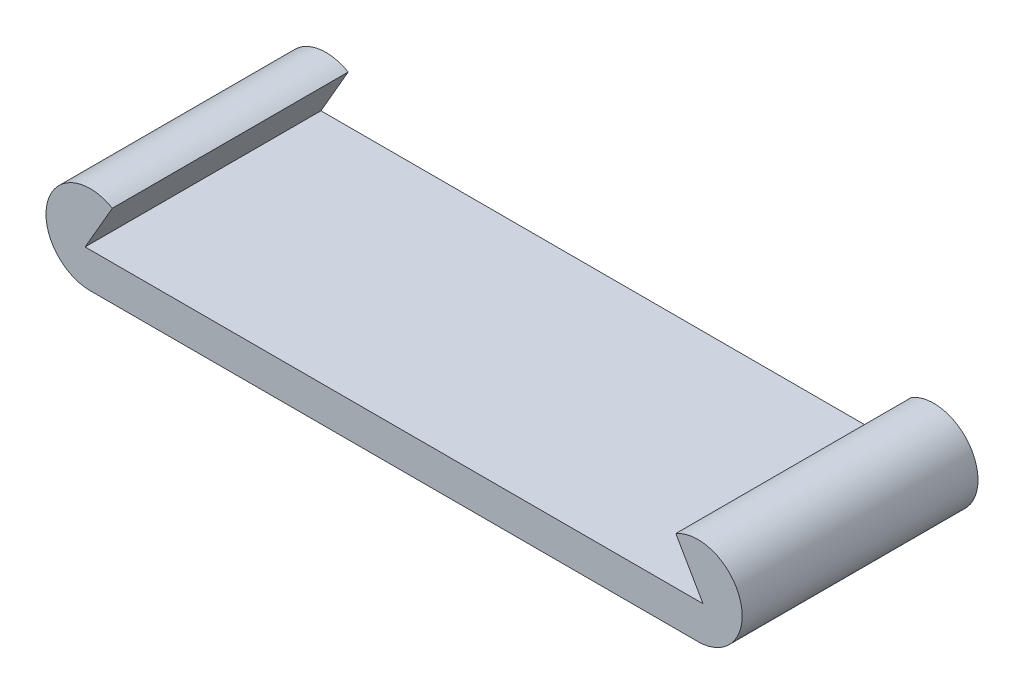
ISO-10303-21;
HEADER;
FILE_DESCRIPTION(('STEP AP214'),'2;1');
FILE_NAME('part.step','',(''),(''),'','','');
FILE_SCHEMA(('AUTOMOTIVE_DESIGN { 1 0 10303 214 1 1 1 1 }'));
ENDSEC;
DATA;
#1=APPLICATION_CONTEXT('core data for automotive mechanical design processes');
#2=APPLICATION_PROTOCOL_DEFINITION('international standard','automotive_design',2000,#1);
#3=PRODUCT_CONTEXT('',#1,'mechanical');
#4=PRODUCT('Part','Part','',(#3));
#5=PRODUCT_RELATED_PRODUCT_CATEGORY('part','',(#4));
#6=PRODUCT_DEFINITION_FORMATION('','',#4);
#7=PRODUCT_DEFINITION_CONTEXT('part definition',#1,'design');
#8=PRODUCT_DEFINITION('design','',#6,#7);
#9=PRODUCT_DEFINITION_SHAPE('','',#8);
#10=(LENGTH_UNIT() NAMED_UNIT(*) SI_UNIT(.MILLI.,.METRE.));
#11=(NAMED_UNIT(*) PLANE_ANGLE_UNIT() SI_UNIT($,.RADIAN.));
#12=(NAMED_UNIT(*) SI_UNIT($,.STERADIAN.) SOLID_ANGLE_UNIT());
#13=UNCERTAINTY_MEASURE_WITH_UNIT(LENGTH_MEASURE(1.E-05),#10,'distance_accuracy_value','');
#14=(GEOMETRIC_REPRESENTATION_CONTEXT(3) GLOBAL_UNCERTAINTY_ASSIGNED_CONTEXT((#13)) GLOBAL_UNIT_ASSIGNED_CONTEXT((#10,
#11,#12)) REPRESENTATION_CONTEXT('',''));
#15=CARTESIAN_POINT('',(0.,0.,0.));
#16=DIRECTION('',(0.,0.,1.));
#17=DIRECTION('',(1.,0.,0.));
#18=AXIS2_PLACEMENT_3D('',#15,#16,#17);
#19=CARTESIAN_POINT('',(13.1,1.5,10.));
#20=DIRECTION('',(0.,-1.,0.));
#21=DIRECTION('',(0.,0.,-1.));
#22=AXIS2_PLACEMENT_3D('',#19,#20,#21);
#23=PLANE('',#22);
#24=DIRECTION('',(-1.,0.,0.));
#25=VECTOR('',#24,1.);
#26=CARTESIAN_POINT('',(13.1,1.5,0.));
#27=LINE('',#26,#25);
#28=CARTESIAN_POINT('',(13.1,1.5,0.));
#29=VERTEX_POINT('',#28);
#30=CARTESIAN_POINT('',(-13.1,1.5,0.));
#31=VERTEX_POINT('',#30);
#32=EDGE_CURVE('E115',#29,#31,#27,.T.);
#33=ORIENTED_EDGE('',*,*,#32,.T.);
#34=DIRECTION('',(0.,0.,-1.));
#35=VECTOR('',#34,1.);
#36=CARTESIAN_POINT('',(-13.1,1.5,10.));
#37=LINE('',#36,#35);
#38=CARTESIAN_POINT('',(-13.1,1.5,10.));
#39=VERTEX_POINT('',#38);
#40=EDGE_CURVE('E11',#39,#31,#37,.T.);
#41=ORIENTED_EDGE('',*,*,#40,.F.);
#42=DIRECTION('',(-1.,0.,0.));
#43=VECTOR('',#42,1.);
#44=CARTESIAN_POINT('',(13.1,1.5,10.));
#45=LINE('',#44,#43);
#46=CARTESIAN_POINT('',(13.1,1.5,10.));
#47=VERTEX_POINT('',#46);
#48=EDGE_CURVE('E125',#47,#39,#45,.T.);
#49=ORIENTED_EDGE('',*,*,#48,.F.);
#50=DIRECTION('',(0.,0.,-1.));
#51=VECTOR('',#50,1.);
#52=CARTESIAN_POINT('',(13.1,1.5,10.));
#53=LINE('',#52,#51);
#54=EDGE_CURVE('E111',#47,#29,#53,.T.);
#55=ORIENTED_EDGE('',*,*,#54,.T.);
#56=EDGE_LOOP('',(#33,#41,#49,#55));
#57=FACE_BOUND('',#56,.T.);
#58=ADVANCED_FACE('F31',(#57),#23,.F.);
#59=CARTESIAN_POINT('',(-13.1,1.5,10.));
#60=DIRECTION('',(-0.866025403784441,0.499999999999997,0.));
#61=DIRECTION('',(-0.499999999999997,-0.866025403784441,0.));
#62=AXIS2_PLACEMENT_3D('',#59,#60,#61);
#63=PLANE('',#62);
#64=DIRECTION('',(0.499999999999997,0.86602540378444,0.));
#65=VECTOR('',#64,1.);
#66=CARTESIAN_POINT('',(-13.1,1.5,0.));
#67=LINE('',#66,#65);
#68=CARTESIAN_POINT('',(-11.9452994616208,3.5,0.));
#69=VERTEX_POINT('',#68);
#70=EDGE_CURVE('E118',#31,#69,#67,.T.);
#71=ORIENTED_EDGE('',*,*,#70,.T.);
#72=DIRECTION('',(0.,0.,-1.));
#73=VECTOR('',#72,1.);
#74=CARTESIAN_POINT('',(-11.9452994616208,3.5,10.));
#75=LINE('',#74,#73);
#76=CARTESIAN_POINT('',(-11.9452994616208,3.5,10.));
#77=VERTEX_POINT('',#76);
#78=EDGE_CURVE('E39',#77,#69,#75,.T.);
#79=ORIENTED_EDGE('',*,*,#78,.F.);
#80=DIRECTION('',(0.499999999999997,0.86602540378444,0.));
#81=VECTOR('',#80,1.);
#82=CARTESIAN_POINT('',(-13.1,1.5,10.));
#83=LINE('',#82,#81);
#84=EDGE_CURVE('E84',#39,#77,#83,.T.);
#85=ORIENTED_EDGE('',*,*,#84,.F.);
#86=ORIENTED_EDGE('',*,*,#40,.T.);
#87=EDGE_LOOP('',(#71,#79,#85,#86));
#88=FACE_BOUND('',#87,.T.);
#89=ADVANCED_FACE('F149',(#88),#63,.F.);
#90=CARTESIAN_POINT('',(-12.8831216351297,1.87564434701786,10.));
#91=DIRECTION('',(0.,0.,-1.));
#92=DIRECTION('',(-1.,0.,0.));
#93=AXIS2_PLACEMENT_3D('',#90,#91,#92);
#94=CYLINDRICAL_SURFACE('',#93,1.87564434701786);
#95=CARTESIAN_POINT('',(-12.8831216351297,1.87564434701786,0.));
#96=DIRECTION('',(0.,0.,1.));
#97=DIRECTION('',(1.,0.,0.));
#98=AXIS2_PLACEMENT_3D('',#95,#96,#97);
#99=CIRCLE('',#98,1.87564434701786);
#100=CARTESIAN_POINT('',(-12.8831216351297,0.,0.));
#101=VERTEX_POINT('',#100);
#102=EDGE_CURVE('E120',#69,#101,#99,.T.);
#103=ORIENTED_EDGE('',*,*,#102,.T.);
#104=DIRECTION('',(0.,0.,-1.));
#105=VECTOR('',#104,1.);
#106=CARTESIAN_POINT('',(-12.8831216351297,0.,10.));
#107=LINE('',#106,#105);
#108=CARTESIAN_POINT('',(-12.8831216351297,0.,10.));
#109=VERTEX_POINT('',#108);
#110=EDGE_CURVE('E106',#109,#101,#107,.T.);
#111=ORIENTED_EDGE('',*,*,#110,.F.);
#112=CARTESIAN_POINT('',(-12.8831216351297,1.87564434701786,10.));
#113=DIRECTION('',(0.,0.,1.));
#114=DIRECTION('',(1.,0.,0.));
#115=AXIS2_PLACEMENT_3D('',#112,#113,#114);
#116=CIRCLE('',#115,1.87564434701786);
#117=EDGE_CURVE('E97',#77,#109,#116,.T.);
#118=ORIENTED_EDGE('',*,*,#117,.F.);
#119=ORIENTED_EDGE('',*,*,#78,.T.);
#120=EDGE_LOOP('',(#103,#111,#118,#119));
#121=FACE_BOUND('',#120,.T.);
#122=ADVANCED_FACE('F131',(#121),#94,.T.);
#123=CARTESIAN_POINT('',(-12.8831216351297,0.,10.));
#124=DIRECTION('',(0.,1.,0.));
#125=DIRECTION('',(0.,0.,1.));
#126=AXIS2_PLACEMENT_3D('',#123,#124,#125);
#127=PLANE('',#126);
#128=DIRECTION('',(1.,0.,0.));
#129=VECTOR('',#128,1.);
#130=CARTESIAN_POINT('',(-12.8831216351297,0.,0.));
#131=LINE('',#130,#129);
#132=CARTESIAN_POINT('',(12.8831216351297,0.,0.));
#133=VERTEX_POINT('',#132);
#134=EDGE_CURVE('E105',#101,#133,#131,.T.);
#135=ORIENTED_EDGE('',*,*,#134,.T.);
#136=DIRECTION('',(0.,0.,-1.));
#137=VECTOR('',#136,1.);
#138=CARTESIAN_POINT('',(12.8831216351297,0.,10.));
#139=LINE('',#138,#137);
#140=CARTESIAN_POINT('',(12.8831216351297,0.,10.));
#141=VERTEX_POINT('',#140);
#142=EDGE_CURVE('E102',#141,#133,#139,.T.);
#143=ORIENTED_EDGE('',*,*,#142,.F.);
#144=DIRECTION('',(1.,0.,0.));
#145=VECTOR('',#144,1.);
#146=CARTESIAN_POINT('',(-12.8831216351297,0.,10.));
#147=LINE('',#146,#145);
#148=EDGE_CURVE('E91',#109,#141,#147,.T.);
#149=ORIENTED_EDGE('',*,*,#148,.F.);
#150=ORIENTED_EDGE('',*,*,#110,.T.);
#151=EDGE_LOOP('',(#135,#143,#149,#150));
#152=FACE_BOUND('',#151,.T.);
#153=ADVANCED_FACE('F103',(#152),#127,.F.);
#154=CARTESIAN_POINT('',(12.8831216351297,1.87564434701786,10.));
#155=DIRECTION('',(0.,0.,-1.));
#156=DIRECTION('',(-1.,0.,0.));
#157=AXIS2_PLACEMENT_3D('',#154,#155,#156);
#158=CYLINDRICAL_SURFACE('',#157,1.87564434701786);
#159=CARTESIAN_POINT('',(12.8831216351297,1.87564434701786,0.));
#160=DIRECTION('',(0.,0.,1.));
#161=DIRECTION('',(-1.,0.,0.));
#162=AXIS2_PLACEMENT_3D('',#159,#160,#161);
#163=CIRCLE('',#162,1.87564434701786);
#164=CARTESIAN_POINT('',(11.9452994616208,3.5,0.));
#165=VERTEX_POINT('',#164);
#166=EDGE_CURVE('E70',#133,#165,#163,.T.);
#167=ORIENTED_EDGE('',*,*,#166,.T.);
#168=DIRECTION('',(0.,0.,-1.));
#169=VECTOR('',#168,1.);
#170=CARTESIAN_POINT('',(11.9452994616208,3.5,10.));
#171=LINE('',#170,#169);
#172=CARTESIAN_POINT('',(11.9452994616208,3.5,10.));
#173=VERTEX_POINT('',#172);
#174=EDGE_CURVE('E107',#173,#165,#171,.T.);
#175=ORIENTED_EDGE('',*,*,#174,.F.);
#176=CARTESIAN_POINT('',(12.8831216351297,1.87564434701786,10.));
#177=DIRECTION('',(0.,0.,1.));
#178=DIRECTION('',(-1.,0.,0.));
#179=AXIS2_PLACEMENT_3D('',#176,#177,#178);
#180=CIRCLE('',#179,1.87564434701786);
#181=EDGE_CURVE('E95',#141,#173,#180,.T.);
#182=ORIENTED_EDGE('',*,*,#181,.F.);
#183=ORIENTED_EDGE('',*,*,#142,.T.);
#184=EDGE_LOOP('',(#167,#175,#182,#183));
#185=FACE_BOUND('',#184,.T.);
#186=ADVANCED_FACE('F109',(#185),#158,.T.);
#187=CARTESIAN_POINT('',(13.1,1.5,10.));
#188=DIRECTION('',(0.866025403784441,0.499999999999997,0.));
#189=DIRECTION('',(-0.499999999999997,0.866025403784441,0.));
#190=AXIS2_PLACEMENT_3D('',#187,#188,#189);
#191=PLANE('',#190);
#192=DIRECTION('',(0.499999999999997,-0.86602540378444,0.));
#193=VECTOR('',#192,1.);
#194=CARTESIAN_POINT('',(13.1,1.5,0.));
#195=LINE('',#194,#193);
#196=EDGE_CURVE('E76',#165,#29,#195,.T.);
#197=ORIENTED_EDGE('',*,*,#196,.T.);
#198=ORIENTED_EDGE('',*,*,#54,.F.);
#199=DIRECTION('',(0.499999999999997,-0.86602540378444,0.));
#200=VECTOR('',#199,1.);
#201=CARTESIAN_POINT('',(13.1,1.5,10.));
#202=LINE('',#201,#200);
#203=EDGE_CURVE('E47',#173,#47,#202,.T.);
#204=ORIENTED_EDGE('',*,*,#203,.F.);
#205=ORIENTED_EDGE('',*,*,#174,.T.);
#206=EDGE_LOOP('',(#197,#198,#204,#205));
#207=FACE_BOUND('',#206,.T.);
#208=ADVANCED_FACE('F138',(#207),#191,.F.);
#209=CARTESIAN_POINT('',(-12.8831216351297,1.87564434701786,10.));
#210=DIRECTION('',(0.,0.,1.));
#211=DIRECTION('',(1.,0.,0.));
#212=AXIS2_PLACEMENT_3D('',#209,#210,#211);
#213=PLANE('',#212);
#214=ORIENTED_EDGE('',*,*,#48,.T.);
#215=ORIENTED_EDGE('',*,*,#84,.T.);
#216=ORIENTED_EDGE('',*,*,#117,.T.);
#217=ORIENTED_EDGE('',*,*,#148,.T.);
#218=ORIENTED_EDGE('',*,*,#181,.T.);
#219=ORIENTED_EDGE('',*,*,#203,.T.);
#220=EDGE_LOOP('',(#214,#215,#216,#217,#218,#219));
#221=FACE_BOUND('',#220,.T.);
#222=ADVANCED_FACE('F93',(#221),#213,.T.);
#223=CARTESIAN_POINT('',(-12.8831216351297,1.87564434701786,0.));
#224=DIRECTION('',(0.,0.,1.));
#225=DIRECTION('',(1.,0.,0.));
#226=AXIS2_PLACEMENT_3D('',#223,#224,#225);
#227=PLANE('',#226);
#228=ORIENTED_EDGE('',*,*,#32,.F.);
#229=ORIENTED_EDGE('',*,*,#196,.F.);
#230=ORIENTED_EDGE('',*,*,#166,.F.);
#231=ORIENTED_EDGE('',*,*,#134,.F.);
#232=ORIENTED_EDGE('',*,*,#102,.F.);
#233=ORIENTED_EDGE('',*,*,#70,.F.);
#234=EDGE_LOOP('',(#228,#229,#230,#231,#232,#233));
#235=FACE_BOUND('',#234,.T.);
#236=ADVANCED_FACE('F134',(#235),#227,.F.);
#237=CLOSED_SHELL('',(#58,#89,#122,#153,#186,#208,#222,#236));
#238=MANIFOLD_SOLID_BREP('B2',#237);
#239=ADVANCED_BREP_SHAPE_REPRESENTATION('',(#18,#238),#14);
#240=SHAPE_DEFINITION_REPRESENTATION(#9,#239);
ENDSEC;
END-ISO-10303-21;
